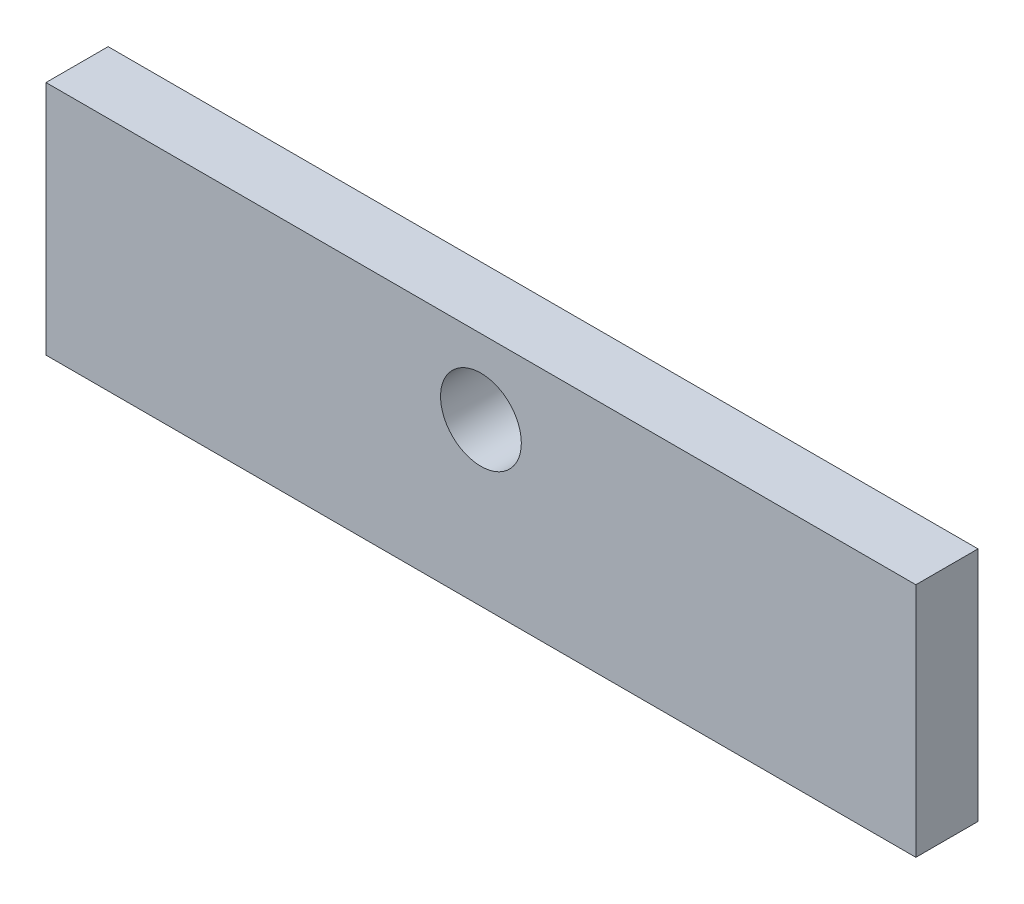
ISO-10303-21;
HEADER;
FILE_DESCRIPTION(('STEP AP214'),'2;1');
FILE_NAME('part.step','',(''),(''),'','','');
FILE_SCHEMA(('AUTOMOTIVE_DESIGN { 1 0 10303 214 1 1 1 1 }'));
ENDSEC;
DATA;
#1=APPLICATION_CONTEXT('core data for automotive mechanical design processes');
#2=APPLICATION_PROTOCOL_DEFINITION('international standard','automotive_design',2000,#1);
#3=PRODUCT_CONTEXT('',#1,'mechanical');
#4=PRODUCT('Part','Part','',(#3));
#5=PRODUCT_RELATED_PRODUCT_CATEGORY('part','',(#4));
#6=PRODUCT_DEFINITION_FORMATION('','',#4);
#7=PRODUCT_DEFINITION_CONTEXT('part definition',#1,'design');
#8=PRODUCT_DEFINITION('design','',#6,#7);
#9=PRODUCT_DEFINITION_SHAPE('','',#8);
#10=(LENGTH_UNIT() NAMED_UNIT(*) SI_UNIT(.MILLI.,.METRE.));
#11=(NAMED_UNIT(*) PLANE_ANGLE_UNIT() SI_UNIT($,.RADIAN.));
#12=(NAMED_UNIT(*) SI_UNIT($,.STERADIAN.) SOLID_ANGLE_UNIT());
#13=UNCERTAINTY_MEASURE_WITH_UNIT(LENGTH_MEASURE(1.E-05),#10,'distance_accuracy_value','');
#14=(GEOMETRIC_REPRESENTATION_CONTEXT(3) GLOBAL_UNCERTAINTY_ASSIGNED_CONTEXT((#13)) GLOBAL_UNIT_ASSIGNED_CONTEXT((#10,
#11,#12)) REPRESENTATION_CONTEXT('',''));
#15=CARTESIAN_POINT('',(0.,0.,0.));
#16=DIRECTION('',(0.,0.,1.));
#17=DIRECTION('',(1.,0.,0.));
#18=AXIS2_PLACEMENT_3D('',#15,#16,#17);
#19=CARTESIAN_POINT('',(-350.,-20.,50.));
#20=DIRECTION('',(1.,0.,0.));
#21=DIRECTION('',(0.,0.,-1.));
#22=AXIS2_PLACEMENT_3D('',#19,#20,#21);
#23=PLANE('',#22);
#24=DIRECTION('',(0.,-1.,0.));
#25=VECTOR('',#24,1.);
#26=CARTESIAN_POINT('',(-350.,-20.,0.));
#27=LINE('',#26,#25);
#28=CARTESIAN_POINT('',(-350.,170.,0.));
#29=VERTEX_POINT('',#28);
#30=CARTESIAN_POINT('',(-350.,-20.,0.));
#31=VERTEX_POINT('',#30);
#32=EDGE_CURVE('E102',#29,#31,#27,.T.);
#33=ORIENTED_EDGE('',*,*,#32,.T.);
#34=DIRECTION('',(0.,0.,-1.));
#35=VECTOR('',#34,1.);
#36=CARTESIAN_POINT('',(-350.,-20.,50.));
#37=LINE('',#36,#35);
#38=CARTESIAN_POINT('',(-350.,-20.,50.));
#39=VERTEX_POINT('',#38);
#40=EDGE_CURVE('E11',#39,#31,#37,.T.);
#41=ORIENTED_EDGE('',*,*,#40,.F.);
#42=DIRECTION('',(0.,-1.,0.));
#43=VECTOR('',#42,1.);
#44=CARTESIAN_POINT('',(-350.,-20.,50.));
#45=LINE('',#44,#43);
#46=CARTESIAN_POINT('',(-350.,170.,50.));
#47=VERTEX_POINT('',#46);
#48=EDGE_CURVE('E90',#47,#39,#45,.T.);
#49=ORIENTED_EDGE('',*,*,#48,.F.);
#50=DIRECTION('',(0.,0.,-1.));
#51=VECTOR('',#50,1.);
#52=CARTESIAN_POINT('',(-350.,170.,50.));
#53=LINE('',#52,#51);
#54=EDGE_CURVE('E98',#47,#29,#53,.T.);
#55=ORIENTED_EDGE('',*,*,#54,.T.);
#56=EDGE_LOOP('',(#33,#41,#49,#55));
#57=FACE_BOUND('',#56,.T.);
#58=ADVANCED_FACE('F39',(#57),#23,.F.);
#59=CARTESIAN_POINT('',(-350.,-20.,50.));
#60=DIRECTION('',(0.,1.,0.));
#61=DIRECTION('',(0.,0.,1.));
#62=AXIS2_PLACEMENT_3D('',#59,#60,#61);
#63=PLANE('',#62);
#64=DIRECTION('',(1.,0.,0.));
#65=VECTOR('',#64,1.);
#66=CARTESIAN_POINT('',(-350.,-20.,0.));
#67=LINE('',#66,#65);
#68=CARTESIAN_POINT('',(350.,-20.,0.));
#69=VERTEX_POINT('',#68);
#70=EDGE_CURVE('E94',#31,#69,#67,.T.);
#71=ORIENTED_EDGE('',*,*,#70,.T.);
#72=DIRECTION('',(0.,0.,-1.));
#73=VECTOR('',#72,1.);
#74=CARTESIAN_POINT('',(350.,-20.,50.));
#75=LINE('',#74,#73);
#76=CARTESIAN_POINT('',(350.,-20.,50.));
#77=VERTEX_POINT('',#76);
#78=EDGE_CURVE('E47',#77,#69,#75,.T.);
#79=ORIENTED_EDGE('',*,*,#78,.F.);
#80=DIRECTION('',(1.,0.,0.));
#81=VECTOR('',#80,1.);
#82=CARTESIAN_POINT('',(-350.,-20.,50.));
#83=LINE('',#82,#81);
#84=EDGE_CURVE('E85',#39,#77,#83,.T.);
#85=ORIENTED_EDGE('',*,*,#84,.F.);
#86=ORIENTED_EDGE('',*,*,#40,.T.);
#87=EDGE_LOOP('',(#71,#79,#85,#86));
#88=FACE_BOUND('',#87,.T.);
#89=ADVANCED_FACE('F93',(#88),#63,.F.);
#90=CARTESIAN_POINT('',(350.,-20.,50.));
#91=DIRECTION('',(-1.,0.,0.));
#92=DIRECTION('',(0.,0.,1.));
#93=AXIS2_PLACEMENT_3D('',#90,#91,#92);
#94=PLANE('',#93);
#95=DIRECTION('',(0.,1.,0.));
#96=VECTOR('',#95,1.);
#97=CARTESIAN_POINT('',(350.,-20.,0.));
#98=LINE('',#97,#96);
#99=CARTESIAN_POINT('',(350.,170.,0.));
#100=VERTEX_POINT('',#99);
#101=EDGE_CURVE('E72',#69,#100,#98,.T.);
#102=ORIENTED_EDGE('',*,*,#101,.T.);
#103=DIRECTION('',(0.,0.,-1.));
#104=VECTOR('',#103,1.);
#105=CARTESIAN_POINT('',(350.,170.,50.));
#106=LINE('',#105,#104);
#107=CARTESIAN_POINT('',(350.,170.,50.));
#108=VERTEX_POINT('',#107);
#109=EDGE_CURVE('E95',#108,#100,#106,.T.);
#110=ORIENTED_EDGE('',*,*,#109,.F.);
#111=DIRECTION('',(0.,1.,0.));
#112=VECTOR('',#111,1.);
#113=CARTESIAN_POINT('',(350.,-20.,50.));
#114=LINE('',#113,#112);
#115=EDGE_CURVE('E88',#77,#108,#114,.T.);
#116=ORIENTED_EDGE('',*,*,#115,.F.);
#117=ORIENTED_EDGE('',*,*,#78,.T.);
#118=EDGE_LOOP('',(#102,#110,#116,#117));
#119=FACE_BOUND('',#118,.T.);
#120=ADVANCED_FACE('F96',(#119),#94,.F.);
#121=CARTESIAN_POINT('',(-350.,170.,50.));
#122=DIRECTION('',(0.,-1.,0.));
#123=DIRECTION('',(0.,0.,-1.));
#124=AXIS2_PLACEMENT_3D('',#121,#122,#123);
#125=PLANE('',#124);
#126=DIRECTION('',(-1.,0.,0.));
#127=VECTOR('',#126,1.);
#128=CARTESIAN_POINT('',(-350.,170.,0.));
#129=LINE('',#128,#127);
#130=EDGE_CURVE('E78',#100,#29,#129,.T.);
#131=ORIENTED_EDGE('',*,*,#130,.T.);
#132=ORIENTED_EDGE('',*,*,#54,.F.);
#133=DIRECTION('',(-1.,0.,0.));
#134=VECTOR('',#133,1.);
#135=CARTESIAN_POINT('',(-350.,170.,50.));
#136=LINE('',#135,#134);
#137=EDGE_CURVE('E55',#108,#47,#136,.T.);
#138=ORIENTED_EDGE('',*,*,#137,.F.);
#139=ORIENTED_EDGE('',*,*,#109,.T.);
#140=EDGE_LOOP('',(#131,#132,#138,#139));
#141=FACE_BOUND('',#140,.T.);
#142=ADVANCED_FACE('F110',(#141),#125,.F.);
#143=CARTESIAN_POINT('',(0.,0.,50.));
#144=DIRECTION('',(0.,0.,-1.));
#145=DIRECTION('',(-1.,0.,0.));
#146=AXIS2_PLACEMENT_3D('',#143,#144,#145);
#147=PLANE('',#146);
#148=CARTESIAN_POINT('',(0.,110.,50.));
#149=DIRECTION('',(0.,0.,1.));
#150=DIRECTION('',(1.,0.,0.));
#151=AXIS2_PLACEMENT_3D('',#148,#149,#150);
#152=CIRCLE('',#151,32.5);
#153=CARTESIAN_POINT('',(32.5000000000001,110.,50.));
#154=VERTEX_POINT('',#153);
#155=EDGE_CURVE('E105',#154,#154,#152,.T.);
#156=ORIENTED_EDGE('',*,*,#155,.F.);
#157=EDGE_LOOP('',(#156));
#158=FACE_BOUND('',#157,.T.);
#159=ORIENTED_EDGE('',*,*,#48,.T.);
#160=ORIENTED_EDGE('',*,*,#84,.T.);
#161=ORIENTED_EDGE('',*,*,#115,.T.);
#162=ORIENTED_EDGE('',*,*,#137,.T.);
#163=EDGE_LOOP('',(#159,#160,#161,#162));
#164=FACE_BOUND('',#163,.T.);
#165=ADVANCED_FACE('F86',(#158,#164),#147,.F.);
#166=CARTESIAN_POINT('',(0.,0.,0.));
#167=DIRECTION('',(0.,0.,-1.));
#168=DIRECTION('',(-1.,0.,0.));
#169=AXIS2_PLACEMENT_3D('',#166,#167,#168);
#170=PLANE('',#169);
#171=CARTESIAN_POINT('',(0.,110.,0.));
#172=DIRECTION('',(0.,0.,-1.));
#173=DIRECTION('',(-1.,0.,0.));
#174=AXIS2_PLACEMENT_3D('',#171,#172,#173);
#175=CIRCLE('',#174,32.5);
#176=CARTESIAN_POINT('',(-32.4999999999999,110.,0.));
#177=VERTEX_POINT('',#176);
#178=EDGE_CURVE('E116',#177,#177,#175,.F.);
#179=ORIENTED_EDGE('',*,*,#178,.T.);
#180=EDGE_LOOP('',(#179));
#181=FACE_BOUND('',#180,.T.);
#182=ORIENTED_EDGE('',*,*,#32,.F.);
#183=ORIENTED_EDGE('',*,*,#130,.F.);
#184=ORIENTED_EDGE('',*,*,#101,.F.);
#185=ORIENTED_EDGE('',*,*,#70,.F.);
#186=EDGE_LOOP('',(#182,#183,#184,#185));
#187=FACE_BOUND('',#186,.T.);
#188=ADVANCED_FACE('F113',(#181,#187),#170,.T.);
#189=CARTESIAN_POINT('',(0.,110.,-0.001000000000001));
#190=DIRECTION('',(0.,0.,1.));
#191=DIRECTION('',(1.,0.,0.));
#192=AXIS2_PLACEMENT_3D('',#189,#190,#191);
#193=CYLINDRICAL_SURFACE('',#192,32.5);
#194=ORIENTED_EDGE('',*,*,#178,.F.);
#195=EDGE_LOOP('',(#194));
#196=FACE_BOUND('',#195,.T.);
#197=ORIENTED_EDGE('',*,*,#155,.T.);
#198=EDGE_LOOP('',(#197));
#199=FACE_BOUND('',#198,.T.);
#200=ADVANCED_FACE('F122',(#196,#199),#193,.F.);
#201=CLOSED_SHELL('',(#58,#89,#120,#142,#165,#188,#200));
#202=MANIFOLD_SOLID_BREP('B2',#201);
#203=ADVANCED_BREP_SHAPE_REPRESENTATION('',(#18,#202),#14);
#204=SHAPE_DEFINITION_REPRESENTATION(#9,#203);
ENDSEC;
END-ISO-10303-21;
